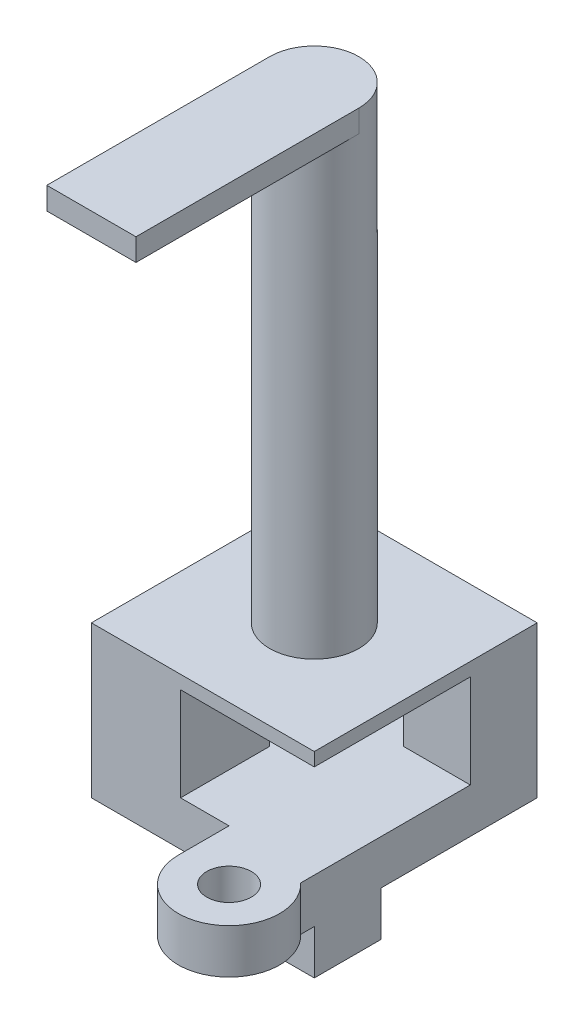
ISO-10303-21;
HEADER;
FILE_DESCRIPTION(('STEP AP214'),'2;1');
FILE_NAME('part.step','',(''),(''),'','','');
FILE_SCHEMA(('AUTOMOTIVE_DESIGN { 1 0 10303 214 1 1 1 1 }'));
ENDSEC;
DATA;
#1=APPLICATION_CONTEXT('core data for automotive mechanical design processes');
#2=APPLICATION_PROTOCOL_DEFINITION('international standard','automotive_design',2000,#1);
#3=PRODUCT_CONTEXT('',#1,'mechanical');
#4=PRODUCT('Part','Part','',(#3));
#5=PRODUCT_RELATED_PRODUCT_CATEGORY('part','',(#4));
#6=PRODUCT_DEFINITION_FORMATION('','',#4);
#7=PRODUCT_DEFINITION_CONTEXT('part definition',#1,'design');
#8=PRODUCT_DEFINITION('design','',#6,#7);
#9=PRODUCT_DEFINITION_SHAPE('','',#8);
#10=(LENGTH_UNIT() NAMED_UNIT(*) SI_UNIT(.MILLI.,.METRE.));
#11=(NAMED_UNIT(*) PLANE_ANGLE_UNIT() SI_UNIT($,.RADIAN.));
#12=(NAMED_UNIT(*) SI_UNIT($,.STERADIAN.) SOLID_ANGLE_UNIT());
#13=UNCERTAINTY_MEASURE_WITH_UNIT(LENGTH_MEASURE(1.E-05),#10,'distance_accuracy_value','');
#14=(GEOMETRIC_REPRESENTATION_CONTEXT(3) GLOBAL_UNCERTAINTY_ASSIGNED_CONTEXT((#13)) GLOBAL_UNIT_ASSIGNED_CONTEXT((#10,
#11,#12)) REPRESENTATION_CONTEXT('',''));
#15=CARTESIAN_POINT('',(0.,0.,0.));
#16=DIRECTION('',(0.,0.,1.));
#17=DIRECTION('',(1.,0.,0.));
#18=AXIS2_PLACEMENT_3D('',#15,#16,#17);
#19=CARTESIAN_POINT('',(42.2387696608268,10.,11.3627174683151));
#20=DIRECTION('',(0.,1.,0.));
#21=DIRECTION('',(0.,0.,1.));
#22=AXIS2_PLACEMENT_3D('',#19,#20,#21);
#23=PLANE('',#22);
#24=DIRECTION('',(0.723776357055051,0.,0.690034625919685));
#25=VECTOR('',#24,1.);
#26=CARTESIAN_POINT('',(3.43626604404177,10.,-40.4752499347023));
#27=LINE('',#26,#25);
#28=CARTESIAN_POINT('',(3.43626604404177,10.,-40.4752499347023));
#29=VERTEX_POINT('',#28);
#30=CARTESIAN_POINT('',(17.9342555580442,10.,-26.6531422168051));
#31=VERTEX_POINT('',#30);
#32=EDGE_CURVE('E367',#29,#31,#27,.T.);
#33=ORIENTED_EDGE('',*,*,#32,.F.);
#34=CARTESIAN_POINT('',(6.64626657364341,10.,-43.8422150146986));
#35=DIRECTION('',(0.,1.,0.));
#36=DIRECTION('',(0.,0.,1.));
#37=AXIS2_PLACEMENT_3D('',#34,#35,#36);
#38=CIRCLE('',#37,4.65194123457691);
#39=CARTESIAN_POINT('',(9.87465405870284,10.,-47.1915539787732));
#40=VERTEX_POINT('',#39);
#41=EDGE_CURVE('E365',#40,#29,#38,.T.);
#42=ORIENTED_EDGE('',*,*,#41,.F.);
#43=DIRECTION('',(-0.719987376276317,0.,-0.693987159825559));
#44=VECTOR('',#43,1.);
#45=CARTESIAN_POINT('',(9.87465405870284,10.,-47.1915539787732));
#46=LINE('',#45,#44);
#47=CARTESIAN_POINT('',(24.29674636625,10.,-33.2902729160126));
#48=VERTEX_POINT('',#47);
#49=EDGE_CURVE('E373',#48,#40,#46,.T.);
#50=ORIENTED_EDGE('',*,*,#49,.F.);
#51=CARTESIAN_POINT('',(21.1064158592592,10.,-29.9804167340048));
#52=DIRECTION('',(0.,1.,0.));
#53=DIRECTION('',(0.,0.,1.));
#54=AXIS2_PLACEMENT_3D('',#51,#52,#53);
#55=CIRCLE('',#54,4.5971030757871);
#56=EDGE_CURVE('E370',#31,#48,#55,.T.);
#57=ORIENTED_EDGE('',*,*,#56,.F.);
#58=EDGE_LOOP('',(#33,#42,#50,#57));
#59=FACE_BOUND('',#58,.T.);
#60=CARTESIAN_POINT('',(42.2387696608268,10.,11.3627174683151));
#61=DIRECTION('',(0.,1.,0.));
#62=DIRECTION('',(0.,0.,1.));
#63=AXIS2_PLACEMENT_3D('',#60,#61,#62);
#64=CIRCLE('',#63,5.);
#65=CARTESIAN_POINT('',(42.2387696608268,10.,16.3627174683151));
#66=VERTEX_POINT('',#65);
#67=EDGE_CURVE('E359',#66,#66,#64,.T.);
#68=ORIENTED_EDGE('',*,*,#67,.F.);
#69=EDGE_LOOP('',(#68));
#70=FACE_BOUND('',#69,.T.);
#71=DIRECTION('',(1.,0.,0.));
#72=VECTOR('',#71,1.);
#73=CARTESIAN_POINT('',(50.,10.,-35.));
#74=LINE('',#73,#72);
#75=CARTESIAN_POINT('',(35.,10.,-35.));
#76=VERTEX_POINT('',#75);
#77=CARTESIAN_POINT('',(50.,10.,-35.));
#78=VERTEX_POINT('',#77);
#79=EDGE_CURVE('E57',#76,#78,#74,.T.);
#80=ORIENTED_EDGE('',*,*,#79,.F.);
#81=DIRECTION('',(0.,0.,1.));
#82=VECTOR('',#81,1.);
#83=CARTESIAN_POINT('',(35.,10.,-50.));
#84=LINE('',#83,#82);
#85=CARTESIAN_POINT('',(35.,10.,-50.));
#86=VERTEX_POINT('',#85);
#87=EDGE_CURVE('E273',#86,#76,#84,.T.);
#88=ORIENTED_EDGE('',*,*,#87,.F.);
#89=DIRECTION('',(-1.,0.,0.));
#90=VECTOR('',#89,1.);
#91=CARTESIAN_POINT('',(0.,10.,-50.));
#92=LINE('',#91,#90);
#93=CARTESIAN_POINT('',(0.,10.,-50.));
#94=VERTEX_POINT('',#93);
#95=EDGE_CURVE('E407',#86,#94,#92,.T.);
#96=ORIENTED_EDGE('',*,*,#95,.T.);
#97=DIRECTION('',(0.,0.,1.));
#98=VECTOR('',#97,1.);
#99=CARTESIAN_POINT('',(0.,10.,0.));
#100=LINE('',#99,#98);
#101=CARTESIAN_POINT('',(0.,10.,-20.));
#102=VERTEX_POINT('',#101);
#103=EDGE_CURVE('E396',#94,#102,#100,.T.);
#104=ORIENTED_EDGE('',*,*,#103,.T.);
#105=DIRECTION('',(-1.,0.,0.));
#106=VECTOR('',#105,1.);
#107=CARTESIAN_POINT('',(0.,10.,-20.));
#108=LINE('',#107,#106);
#109=CARTESIAN_POINT('',(20.,10.,-20.));
#110=VERTEX_POINT('',#109);
#111=EDGE_CURVE('E296',#110,#102,#108,.T.);
#112=ORIENTED_EDGE('',*,*,#111,.F.);
#113=DIRECTION('',(0.,0.,-1.));
#114=VECTOR('',#113,1.);
#115=CARTESIAN_POINT('',(20.,10.,0.));
#116=LINE('',#115,#114);
#117=CARTESIAN_POINT('',(20.,10.,0.));
#118=VERTEX_POINT('',#117);
#119=EDGE_CURVE('E291',#118,#110,#116,.T.);
#120=ORIENTED_EDGE('',*,*,#119,.F.);
#121=DIRECTION('',(1.,0.,0.));
#122=VECTOR('',#121,1.);
#123=CARTESIAN_POINT('',(0.,10.,0.));
#124=LINE('',#123,#122);
#125=CARTESIAN_POINT('',(30.8760521925118,10.,0.));
#126=VERTEX_POINT('',#125);
#127=EDGE_CURVE('E398',#118,#126,#124,.T.);
#128=ORIENTED_EDGE('',*,*,#127,.T.);
#129=DIRECTION('',(0.,0.,1.));
#130=VECTOR('',#129,1.);
#131=CARTESIAN_POINT('',(30.8760521925118,10.,11.3627174683151));
#132=LINE('',#131,#130);
#133=CARTESIAN_POINT('',(30.8760521925118,10.,11.3627174683151));
#134=VERTEX_POINT('',#133);
#135=EDGE_CURVE('E401',#126,#134,#132,.T.);
#136=ORIENTED_EDGE('',*,*,#135,.T.);
#137=CARTESIAN_POINT('',(42.2387696608268,10.,11.3627174683151));
#138=DIRECTION('',(0.,1.,0.));
#139=DIRECTION('',(0.,0.,1.));
#140=AXIS2_PLACEMENT_3D('',#137,#138,#139);
#141=CIRCLE('',#140,11.3627174683151);
#142=CARTESIAN_POINT('',(50.,10.,3.06364210493568));
#143=VERTEX_POINT('',#142);
#144=EDGE_CURVE('E403',#134,#143,#141,.T.);
#145=ORIENTED_EDGE('',*,*,#144,.T.);
#146=DIRECTION('',(0.,0.,-1.));
#147=VECTOR('',#146,1.);
#148=CARTESIAN_POINT('',(50.,10.,0.));
#149=LINE('',#148,#147);
#150=EDGE_CURVE('E405',#143,#78,#149,.T.);
#151=ORIENTED_EDGE('',*,*,#150,.T.);
#152=EDGE_LOOP('',(#80,#88,#96,#104,#112,#120,#128,#136,#145,#151));
#153=FACE_BOUND('',#152,.T.);
#154=ADVANCED_FACE('F33',(#59,#70,#153),#23,.T.);
#155=CARTESIAN_POINT('',(42.2387696608268,0.,11.3627174683151));
#156=DIRECTION('',(0.,1.,0.));
#157=DIRECTION('',(0.,0.,1.));
#158=AXIS2_PLACEMENT_3D('',#155,#156,#157);
#159=PLANE('',#158);
#160=CARTESIAN_POINT('',(42.2387696608268,0.,11.3627174683151));
#161=DIRECTION('',(0.,1.,0.));
#162=DIRECTION('',(0.,0.,1.));
#163=AXIS2_PLACEMENT_3D('',#160,#161,#162);
#164=CIRCLE('',#163,5.);
#165=CARTESIAN_POINT('',(42.2387696608268,0.,16.3627174683151));
#166=VERTEX_POINT('',#165);
#167=EDGE_CURVE('E358',#166,#166,#164,.T.);
#168=ORIENTED_EDGE('',*,*,#167,.T.);
#169=EDGE_LOOP('',(#168));
#170=FACE_BOUND('',#169,.T.);
#171=CARTESIAN_POINT('',(6.64626657364341,0.,-43.8422150146986));
#172=DIRECTION('',(0.,1.,0.));
#173=DIRECTION('',(0.,0.,1.));
#174=AXIS2_PLACEMENT_3D('',#171,#172,#173);
#175=CIRCLE('',#174,4.65194123457691);
#176=CARTESIAN_POINT('',(9.87465405870284,0.,-47.1915539787733));
#177=VERTEX_POINT('',#176);
#178=CARTESIAN_POINT('',(3.43626604404177,0.,-40.4752499347023));
#179=VERTEX_POINT('',#178);
#180=EDGE_CURVE('E362',#177,#179,#175,.T.);
#181=ORIENTED_EDGE('',*,*,#180,.T.);
#182=DIRECTION('',(0.723776357055051,0.,0.690034625919685));
#183=VECTOR('',#182,1.);
#184=CARTESIAN_POINT('',(3.43626604404177,0.,-40.4752499347023));
#185=LINE('',#184,#183);
#186=CARTESIAN_POINT('',(17.9342555580442,0.,-26.6531422168051));
#187=VERTEX_POINT('',#186);
#188=EDGE_CURVE('E378',#179,#187,#185,.T.);
#189=ORIENTED_EDGE('',*,*,#188,.T.);
#190=CARTESIAN_POINT('',(21.1064158592592,0.,-29.9804167340048));
#191=DIRECTION('',(0.,1.,0.));
#192=DIRECTION('',(0.,0.,1.));
#193=AXIS2_PLACEMENT_3D('',#190,#191,#192);
#194=CIRCLE('',#193,4.5971030757871);
#195=CARTESIAN_POINT('',(24.29674636625,0.,-33.2902729160126));
#196=VERTEX_POINT('',#195);
#197=EDGE_CURVE('E381',#187,#196,#194,.T.);
#198=ORIENTED_EDGE('',*,*,#197,.T.);
#199=DIRECTION('',(-0.719987376276317,0.,-0.693987159825559));
#200=VECTOR('',#199,1.);
#201=CARTESIAN_POINT('',(9.87465405870284,0.,-47.1915539787732));
#202=LINE('',#201,#200);
#203=EDGE_CURVE('E368',#196,#177,#202,.T.);
#204=ORIENTED_EDGE('',*,*,#203,.T.);
#205=EDGE_LOOP('',(#181,#189,#198,#204));
#206=FACE_BOUND('',#205,.T.);
#207=DIRECTION('',(-1.,0.,0.));
#208=VECTOR('',#207,1.);
#209=CARTESIAN_POINT('',(50.,0.,0.));
#210=LINE('',#209,#208);
#211=CARTESIAN_POINT('',(50.,0.,0.));
#212=VERTEX_POINT('',#211);
#213=CARTESIAN_POINT('',(35.,0.,0.));
#214=VERTEX_POINT('',#213);
#215=EDGE_CURVE('E312',#212,#214,#210,.T.);
#216=ORIENTED_EDGE('',*,*,#215,.F.);
#217=DIRECTION('',(0.,0.,-1.));
#218=VECTOR('',#217,1.);
#219=CARTESIAN_POINT('',(50.,0.,0.));
#220=LINE('',#219,#218);
#221=CARTESIAN_POINT('',(50.,0.,3.06364210493568));
#222=VERTEX_POINT('',#221);
#223=EDGE_CURVE('E420',#222,#212,#220,.T.);
#224=ORIENTED_EDGE('',*,*,#223,.F.);
#225=CARTESIAN_POINT('',(42.2387696608268,0.,11.3627174683151));
#226=DIRECTION('',(0.,1.,0.));
#227=DIRECTION('',(0.,0.,1.));
#228=AXIS2_PLACEMENT_3D('',#225,#226,#227);
#229=CIRCLE('',#228,11.3627174683151);
#230=CARTESIAN_POINT('',(30.8760521925118,0.,11.3627174683151));
#231=VERTEX_POINT('',#230);
#232=EDGE_CURVE('E416',#231,#222,#229,.T.);
#233=ORIENTED_EDGE('',*,*,#232,.F.);
#234=DIRECTION('',(0.,0.,1.));
#235=VECTOR('',#234,1.);
#236=CARTESIAN_POINT('',(30.8760521925118,0.,11.3627174683151));
#237=LINE('',#236,#235);
#238=CARTESIAN_POINT('',(30.8760521925118,0.,0.));
#239=VERTEX_POINT('',#238);
#240=EDGE_CURVE('E414',#239,#231,#237,.T.);
#241=ORIENTED_EDGE('',*,*,#240,.F.);
#242=DIRECTION('',(1.,0.,0.));
#243=VECTOR('',#242,1.);
#244=CARTESIAN_POINT('',(0.,0.,0.));
#245=LINE('',#244,#243);
#246=CARTESIAN_POINT('',(0.,0.,0.));
#247=VERTEX_POINT('',#246);
#248=EDGE_CURVE('E412',#247,#239,#245,.T.);
#249=ORIENTED_EDGE('',*,*,#248,.F.);
#250=DIRECTION('',(0.,0.,1.));
#251=VECTOR('',#250,1.);
#252=CARTESIAN_POINT('',(0.,0.,0.));
#253=LINE('',#252,#251);
#254=CARTESIAN_POINT('',(0.,0.,-50.));
#255=VERTEX_POINT('',#254);
#256=EDGE_CURVE('E395',#255,#247,#253,.T.);
#257=ORIENTED_EDGE('',*,*,#256,.F.);
#258=DIRECTION('',(-1.,0.,0.));
#259=VECTOR('',#258,1.);
#260=CARTESIAN_POINT('',(0.,0.,-50.));
#261=LINE('',#260,#259);
#262=CARTESIAN_POINT('',(50.,0.,-50.));
#263=VERTEX_POINT('',#262);
#264=EDGE_CURVE('E399',#263,#255,#261,.T.);
#265=ORIENTED_EDGE('',*,*,#264,.F.);
#266=CARTESIAN_POINT('',(50.,0.,-15.));
#267=VERTEX_POINT('',#266);
#268=EDGE_CURVE('E419',#267,#263,#220,.T.);
#269=ORIENTED_EDGE('',*,*,#268,.F.);
#270=DIRECTION('',(1.,0.,0.));
#271=VECTOR('',#270,1.);
#272=CARTESIAN_POINT('',(50.,0.,-15.));
#273=LINE('',#272,#271);
#274=CARTESIAN_POINT('',(45.,0.,-15.));
#275=VERTEX_POINT('',#274);
#276=EDGE_CURVE('E317',#275,#267,#273,.T.);
#277=ORIENTED_EDGE('',*,*,#276,.F.);
#278=DIRECTION('',(0.,0.,-1.));
#279=VECTOR('',#278,1.);
#280=CARTESIAN_POINT('',(45.,0.,-5.));
#281=LINE('',#280,#279);
#282=CARTESIAN_POINT('',(45.,0.,-5.));
#283=VERTEX_POINT('',#282);
#284=EDGE_CURVE('E336',#283,#275,#281,.T.);
#285=ORIENTED_EDGE('',*,*,#284,.F.);
#286=DIRECTION('',(1.,0.,0.));
#287=VECTOR('',#286,1.);
#288=CARTESIAN_POINT('',(45.,0.,-5.));
#289=LINE('',#288,#287);
#290=CARTESIAN_POINT('',(35.,0.,-5.));
#291=VERTEX_POINT('',#290);
#292=EDGE_CURVE('E333',#291,#283,#289,.T.);
#293=ORIENTED_EDGE('',*,*,#292,.F.);
#294=DIRECTION('',(0.,0.,-1.));
#295=VECTOR('',#294,1.);
#296=CARTESIAN_POINT('',(35.,0.,0.));
#297=LINE('',#296,#295);
#298=EDGE_CURVE('E330',#214,#291,#297,.T.);
#299=ORIENTED_EDGE('',*,*,#298,.F.);
#300=EDGE_LOOP('',(#216,#224,#233,#241,#249,#257,#265,#269,#277,#285,#293,#299));
#301=FACE_BOUND('',#300,.T.);
#302=ADVANCED_FACE('F452',(#170,#206,#301),#159,.F.);
#303=CARTESIAN_POINT('',(0.,10.,0.));
#304=DIRECTION('',(1.,0.,0.));
#305=DIRECTION('',(0.,0.,-1.));
#306=AXIS2_PLACEMENT_3D('',#303,#304,#305);
#307=PLANE('',#306);
#308=ORIENTED_EDGE('',*,*,#256,.T.);
#309=DIRECTION('',(0.,-1.,0.));
#310=VECTOR('',#309,1.);
#311=CARTESIAN_POINT('',(0.,10.,0.));
#312=LINE('',#311,#310);
#313=CARTESIAN_POINT('',(0.,34.,0.));
#314=VERTEX_POINT('',#313);
#315=EDGE_CURVE('E37',#314,#247,#312,.T.);
#316=ORIENTED_EDGE('',*,*,#315,.F.);
#317=DIRECTION('',(0.,0.,1.));
#318=VECTOR('',#317,1.);
#319=CARTESIAN_POINT('',(0.,34.,0.));
#320=LINE('',#319,#318);
#321=CARTESIAN_POINT('',(0.,34.,-50.));
#322=VERTEX_POINT('',#321);
#323=EDGE_CURVE('E248',#322,#314,#320,.T.);
#324=ORIENTED_EDGE('',*,*,#323,.F.);
#325=DIRECTION('',(0.,-1.,0.));
#326=VECTOR('',#325,1.);
#327=CARTESIAN_POINT('',(0.,34.,-50.));
#328=LINE('',#327,#326);
#329=CARTESIAN_POINT('',(0.,31.,-50.));
#330=VERTEX_POINT('',#329);
#331=EDGE_CURVE('E259',#322,#330,#328,.T.);
#332=ORIENTED_EDGE('',*,*,#331,.T.);
#333=DIRECTION('',(0.,0.,1.));
#334=VECTOR('',#333,1.);
#335=CARTESIAN_POINT('',(0.,31.,0.));
#336=LINE('',#335,#334);
#337=CARTESIAN_POINT('',(0.,31.,-20.));
#338=VERTEX_POINT('',#337);
#339=EDGE_CURVE('E242',#330,#338,#336,.T.);
#340=ORIENTED_EDGE('',*,*,#339,.T.);
#341=DIRECTION('',(0.,-1.,0.));
#342=VECTOR('',#341,1.);
#343=CARTESIAN_POINT('',(0.,31.,-20.));
#344=LINE('',#343,#342);
#345=EDGE_CURVE('E299',#338,#102,#344,.T.);
#346=ORIENTED_EDGE('',*,*,#345,.T.);
#347=ORIENTED_EDGE('',*,*,#103,.F.);
#348=DIRECTION('',(0.,-1.,0.));
#349=VECTOR('',#348,1.);
#350=CARTESIAN_POINT('',(0.,10.,-50.));
#351=LINE('',#350,#349);
#352=EDGE_CURVE('E409',#94,#255,#351,.T.);
#353=ORIENTED_EDGE('',*,*,#352,.T.);
#354=EDGE_LOOP('',(#308,#316,#324,#332,#340,#346,#347,#353));
#355=FACE_BOUND('',#354,.T.);
#356=ADVANCED_FACE('F35',(#355),#307,.F.);
#357=CARTESIAN_POINT('',(0.,10.,0.));
#358=DIRECTION('',(0.,0.,-1.));
#359=DIRECTION('',(-1.,0.,0.));
#360=AXIS2_PLACEMENT_3D('',#357,#358,#359);
#361=PLANE('',#360);
#362=ORIENTED_EDGE('',*,*,#248,.T.);
#363=DIRECTION('',(0.,-1.,0.));
#364=VECTOR('',#363,1.);
#365=CARTESIAN_POINT('',(30.8760521925118,10.,0.));
#366=LINE('',#365,#364);
#367=EDGE_CURVE('E434',#126,#239,#366,.T.);
#368=ORIENTED_EDGE('',*,*,#367,.F.);
#369=ORIENTED_EDGE('',*,*,#127,.F.);
#370=DIRECTION('',(0.,-1.,0.));
#371=VECTOR('',#370,1.);
#372=CARTESIAN_POINT('',(20.,31.,0.));
#373=LINE('',#372,#371);
#374=CARTESIAN_POINT('',(20.,31.,0.));
#375=VERTEX_POINT('',#374);
#376=EDGE_CURVE('E309',#375,#118,#373,.T.);
#377=ORIENTED_EDGE('',*,*,#376,.F.);
#378=DIRECTION('',(1.,0.,0.));
#379=VECTOR('',#378,1.);
#380=CARTESIAN_POINT('',(0.,31.,0.));
#381=LINE('',#380,#379);
#382=CARTESIAN_POINT('',(50.,31.,0.));
#383=VERTEX_POINT('',#382);
#384=EDGE_CURVE('E262',#375,#383,#381,.T.);
#385=ORIENTED_EDGE('',*,*,#384,.T.);
#386=DIRECTION('',(0.,-1.,0.));
#387=VECTOR('',#386,1.);
#388=CARTESIAN_POINT('',(50.,34.,0.));
#389=LINE('',#388,#387);
#390=CARTESIAN_POINT('',(50.,34.,0.));
#391=VERTEX_POINT('',#390);
#392=EDGE_CURVE('E270',#391,#383,#389,.T.);
#393=ORIENTED_EDGE('',*,*,#392,.F.);
#394=DIRECTION('',(1.,0.,0.));
#395=VECTOR('',#394,1.);
#396=CARTESIAN_POINT('',(0.,34.,0.));
#397=LINE('',#396,#395);
#398=EDGE_CURVE('E251',#314,#391,#397,.T.);
#399=ORIENTED_EDGE('',*,*,#398,.F.);
#400=ORIENTED_EDGE('',*,*,#315,.T.);
#401=EDGE_LOOP('',(#362,#368,#369,#377,#385,#393,#399,#400));
#402=FACE_BOUND('',#401,.T.);
#403=ADVANCED_FACE('F443',(#402),#361,.F.);
#404=CARTESIAN_POINT('',(30.8760521925118,10.,11.3627174683151));
#405=DIRECTION('',(1.,0.,0.));
#406=DIRECTION('',(0.,0.,-1.));
#407=AXIS2_PLACEMENT_3D('',#404,#405,#406);
#408=PLANE('',#407);
#409=ORIENTED_EDGE('',*,*,#240,.T.);
#410=DIRECTION('',(0.,-1.,0.));
#411=VECTOR('',#410,1.);
#412=CARTESIAN_POINT('',(30.8760521925118,10.,11.3627174683151));
#413=LINE('',#412,#411);
#414=EDGE_CURVE('E432',#134,#231,#413,.T.);
#415=ORIENTED_EDGE('',*,*,#414,.F.);
#416=ORIENTED_EDGE('',*,*,#135,.F.);
#417=ORIENTED_EDGE('',*,*,#367,.T.);
#418=EDGE_LOOP('',(#409,#415,#416,#417));
#419=FACE_BOUND('',#418,.T.);
#420=ADVANCED_FACE('F455',(#419),#408,.F.);
#421=CARTESIAN_POINT('',(42.2387696608268,10.,11.3627174683151));
#422=DIRECTION('',(0.,-1.,0.));
#423=DIRECTION('',(0.,0.,-1.));
#424=AXIS2_PLACEMENT_3D('',#421,#422,#423);
#425=CYLINDRICAL_SURFACE('',#424,11.3627174683151);
#426=ORIENTED_EDGE('',*,*,#232,.T.);
#427=DIRECTION('',(0.,-1.,0.));
#428=VECTOR('',#427,1.);
#429=CARTESIAN_POINT('',(50.,10.,3.06364210493568));
#430=LINE('',#429,#428);
#431=EDGE_CURVE('E429',#143,#222,#430,.T.);
#432=ORIENTED_EDGE('',*,*,#431,.F.);
#433=ORIENTED_EDGE('',*,*,#144,.F.);
#434=ORIENTED_EDGE('',*,*,#414,.T.);
#435=EDGE_LOOP('',(#426,#432,#433,#434));
#436=FACE_BOUND('',#435,.T.);
#437=ADVANCED_FACE('F458',(#436),#425,.T.);
#438=CARTESIAN_POINT('',(50.,10.,0.));
#439=DIRECTION('',(-1.,0.,0.));
#440=DIRECTION('',(0.,0.,1.));
#441=AXIS2_PLACEMENT_3D('',#438,#439,#440);
#442=PLANE('',#441);
#443=ORIENTED_EDGE('',*,*,#223,.T.);
#444=DIRECTION('',(0.,1.,0.));
#445=VECTOR('',#444,1.);
#446=CARTESIAN_POINT('',(50.,-10.,0.));
#447=LINE('',#446,#445);
#448=CARTESIAN_POINT('',(50.,-10.,0.));
#449=VERTEX_POINT('',#448);
#450=EDGE_CURVE('E327',#449,#212,#447,.T.);
#451=ORIENTED_EDGE('',*,*,#450,.F.);
#452=DIRECTION('',(0.,0.,1.));
#453=VECTOR('',#452,1.);
#454=CARTESIAN_POINT('',(50.,-10.,-15.));
#455=LINE('',#454,#453);
#456=CARTESIAN_POINT('',(50.,-10.,-15.));
#457=VERTEX_POINT('',#456);
#458=EDGE_CURVE('E325',#457,#449,#455,.T.);
#459=ORIENTED_EDGE('',*,*,#458,.F.);
#460=DIRECTION('',(0.,1.,0.));
#461=VECTOR('',#460,1.);
#462=CARTESIAN_POINT('',(50.,-10.,-15.));
#463=LINE('',#462,#461);
#464=EDGE_CURVE('E343',#457,#267,#463,.T.);
#465=ORIENTED_EDGE('',*,*,#464,.T.);
#466=ORIENTED_EDGE('',*,*,#268,.T.);
#467=DIRECTION('',(0.,-1.,0.));
#468=VECTOR('',#467,1.);
#469=CARTESIAN_POINT('',(50.,10.,-50.));
#470=LINE('',#469,#468);
#471=CARTESIAN_POINT('',(50.,34.,-50.));
#472=VERTEX_POINT('',#471);
#473=EDGE_CURVE('E426',#472,#263,#470,.T.);
#474=ORIENTED_EDGE('',*,*,#473,.F.);
#475=DIRECTION('',(0.,0.,-1.));
#476=VECTOR('',#475,1.);
#477=CARTESIAN_POINT('',(50.,34.,0.));
#478=LINE('',#477,#476);
#479=EDGE_CURVE('E254',#391,#472,#478,.T.);
#480=ORIENTED_EDGE('',*,*,#479,.F.);
#481=ORIENTED_EDGE('',*,*,#392,.T.);
#482=DIRECTION('',(0.,0.,-1.));
#483=VECTOR('',#482,1.);
#484=CARTESIAN_POINT('',(50.,31.,0.));
#485=LINE('',#484,#483);
#486=CARTESIAN_POINT('',(50.,31.,-35.));
#487=VERTEX_POINT('',#486);
#488=EDGE_CURVE('E264',#383,#487,#485,.T.);
#489=ORIENTED_EDGE('',*,*,#488,.T.);
#490=DIRECTION('',(0.,-1.,0.));
#491=VECTOR('',#490,1.);
#492=CARTESIAN_POINT('',(50.,31.,-35.));
#493=LINE('',#492,#491);
#494=EDGE_CURVE('E280',#487,#78,#493,.T.);
#495=ORIENTED_EDGE('',*,*,#494,.T.);
#496=ORIENTED_EDGE('',*,*,#150,.F.);
#497=ORIENTED_EDGE('',*,*,#431,.T.);
#498=EDGE_LOOP('',(#443,#451,#459,#465,#466,#474,#480,#481,#489,#495,#496,#497));
#499=FACE_BOUND('',#498,.T.);
#500=ADVANCED_FACE('F472',(#499),#442,.F.);
#501=CARTESIAN_POINT('',(0.,10.,-50.));
#502=DIRECTION('',(0.,0.,1.));
#503=DIRECTION('',(1.,0.,0.));
#504=AXIS2_PLACEMENT_3D('',#501,#502,#503);
#505=PLANE('',#504);
#506=ORIENTED_EDGE('',*,*,#264,.T.);
#507=ORIENTED_EDGE('',*,*,#352,.F.);
#508=ORIENTED_EDGE('',*,*,#95,.F.);
#509=DIRECTION('',(0.,-1.,0.));
#510=VECTOR('',#509,1.);
#511=CARTESIAN_POINT('',(35.,31.,-50.));
#512=LINE('',#511,#510);
#513=CARTESIAN_POINT('',(35.,31.,-50.));
#514=VERTEX_POINT('',#513);
#515=EDGE_CURVE('E288',#514,#86,#512,.T.);
#516=ORIENTED_EDGE('',*,*,#515,.F.);
#517=DIRECTION('',(-1.,0.,0.));
#518=VECTOR('',#517,1.);
#519=CARTESIAN_POINT('',(0.,31.,-50.));
#520=LINE('',#519,#518);
#521=EDGE_CURVE('E252',#514,#330,#520,.T.);
#522=ORIENTED_EDGE('',*,*,#521,.T.);
#523=ORIENTED_EDGE('',*,*,#331,.F.);
#524=DIRECTION('',(-1.,0.,0.));
#525=VECTOR('',#524,1.);
#526=CARTESIAN_POINT('',(0.,34.,-50.));
#527=LINE('',#526,#525);
#528=EDGE_CURVE('E257',#472,#322,#527,.T.);
#529=ORIENTED_EDGE('',*,*,#528,.F.);
#530=ORIENTED_EDGE('',*,*,#473,.T.);
#531=EDGE_LOOP('',(#506,#507,#508,#516,#522,#523,#529,#530));
#532=FACE_BOUND('',#531,.T.);
#533=ADVANCED_FACE('F478',(#532),#505,.F.);
#534=CARTESIAN_POINT('',(6.64626657364341,10.,-43.8422150146986));
#535=DIRECTION('',(0.,-1.,0.));
#536=DIRECTION('',(0.,0.,-1.));
#537=AXIS2_PLACEMENT_3D('',#534,#535,#536);
#538=CYLINDRICAL_SURFACE('',#537,4.65194123457691);
#539=ORIENTED_EDGE('',*,*,#180,.F.);
#540=DIRECTION('',(0.,-1.,0.));
#541=VECTOR('',#540,1.);
#542=CARTESIAN_POINT('',(9.87465405870284,10.,-47.1915539787732));
#543=LINE('',#542,#541);
#544=EDGE_CURVE('E375',#40,#177,#543,.T.);
#545=ORIENTED_EDGE('',*,*,#544,.F.);
#546=ORIENTED_EDGE('',*,*,#41,.T.);
#547=DIRECTION('',(0.,-1.,0.));
#548=VECTOR('',#547,1.);
#549=CARTESIAN_POINT('',(3.43626604404177,10.,-40.4752499347023));
#550=LINE('',#549,#548);
#551=EDGE_CURVE('E392',#29,#179,#550,.T.);
#552=ORIENTED_EDGE('',*,*,#551,.T.);
#553=EDGE_LOOP('',(#539,#545,#546,#552));
#554=FACE_BOUND('',#553,.T.);
#555=ADVANCED_FACE('F532',(#554),#538,.F.);
#556=CARTESIAN_POINT('',(3.43626604404177,10.,-40.4752499347023));
#557=DIRECTION('',(0.690034625919685,0.,-0.723776357055051));
#558=DIRECTION('',(-0.723776357055051,0.,-0.690034625919685));
#559=AXIS2_PLACEMENT_3D('',#556,#557,#558);
#560=PLANE('',#559);
#561=ORIENTED_EDGE('',*,*,#188,.F.);
#562=ORIENTED_EDGE('',*,*,#551,.F.);
#563=ORIENTED_EDGE('',*,*,#32,.T.);
#564=DIRECTION('',(0.,-1.,0.));
#565=VECTOR('',#564,1.);
#566=CARTESIAN_POINT('',(17.9342555580442,10.,-26.6531422168051));
#567=LINE('',#566,#565);
#568=EDGE_CURVE('E390',#31,#187,#567,.T.);
#569=ORIENTED_EDGE('',*,*,#568,.T.);
#570=EDGE_LOOP('',(#561,#562,#563,#569));
#571=FACE_BOUND('',#570,.T.);
#572=ADVANCED_FACE('F791',(#571),#560,.T.);
#573=CARTESIAN_POINT('',(21.1064158592592,10.,-29.9804167340048));
#574=DIRECTION('',(0.,-1.,0.));
#575=DIRECTION('',(0.,0.,-1.));
#576=AXIS2_PLACEMENT_3D('',#573,#574,#575);
#577=CYLINDRICAL_SURFACE('',#576,4.5971030757871);
#578=ORIENTED_EDGE('',*,*,#197,.F.);
#579=ORIENTED_EDGE('',*,*,#568,.F.);
#580=ORIENTED_EDGE('',*,*,#56,.T.);
#581=DIRECTION('',(0.,-1.,0.));
#582=VECTOR('',#581,1.);
#583=CARTESIAN_POINT('',(24.29674636625,10.,-33.2902729160126));
#584=LINE('',#583,#582);
#585=EDGE_CURVE('E388',#48,#196,#584,.T.);
#586=ORIENTED_EDGE('',*,*,#585,.T.);
#587=EDGE_LOOP('',(#578,#579,#580,#586));
#588=FACE_BOUND('',#587,.T.);
#589=ADVANCED_FACE('F800',(#588),#577,.F.);
#590=CARTESIAN_POINT('',(9.87465405870284,10.,-47.1915539787732));
#591=DIRECTION('',(-0.693987159825559,0.,0.719987376276317));
#592=DIRECTION('',(0.719987376276317,0.,0.693987159825559));
#593=AXIS2_PLACEMENT_3D('',#590,#591,#592);
#594=PLANE('',#593);
#595=ORIENTED_EDGE('',*,*,#203,.F.);
#596=ORIENTED_EDGE('',*,*,#585,.F.);
#597=ORIENTED_EDGE('',*,*,#49,.T.);
#598=ORIENTED_EDGE('',*,*,#544,.T.);
#599=EDGE_LOOP('',(#595,#596,#597,#598));
#600=FACE_BOUND('',#599,.T.);
#601=ADVANCED_FACE('F808',(#600),#594,.T.);
#602=CARTESIAN_POINT('',(42.2387696608268,10.,11.3627174683151));
#603=DIRECTION('',(0.,-1.,0.));
#604=DIRECTION('',(0.,0.,-1.));
#605=AXIS2_PLACEMENT_3D('',#602,#603,#604);
#606=CYLINDRICAL_SURFACE('',#605,5.);
#607=ORIENTED_EDGE('',*,*,#67,.T.);
#608=EDGE_LOOP('',(#607));
#609=FACE_BOUND('',#608,.T.);
#610=ORIENTED_EDGE('',*,*,#167,.F.);
#611=EDGE_LOOP('',(#610));
#612=FACE_BOUND('',#611,.T.);
#613=ADVANCED_FACE('F519',(#609,#612),#606,.F.);
#614=CARTESIAN_POINT('',(50.,-10.,0.));
#615=DIRECTION('',(0.,0.,-1.));
#616=DIRECTION('',(-1.,0.,0.));
#617=AXIS2_PLACEMENT_3D('',#614,#615,#616);
#618=PLANE('',#617);
#619=ORIENTED_EDGE('',*,*,#215,.T.);
#620=DIRECTION('',(0.,1.,0.));
#621=VECTOR('',#620,1.);
#622=CARTESIAN_POINT('',(35.,-10.,0.));
#623=LINE('',#622,#621);
#624=CARTESIAN_POINT('',(35.,-10.,0.));
#625=VERTEX_POINT('',#624);
#626=EDGE_CURVE('E355',#625,#214,#623,.T.);
#627=ORIENTED_EDGE('',*,*,#626,.F.);
#628=DIRECTION('',(-1.,0.,0.));
#629=VECTOR('',#628,1.);
#630=CARTESIAN_POINT('',(50.,-10.,0.));
#631=LINE('',#630,#629);
#632=EDGE_CURVE('E313',#449,#625,#631,.T.);
#633=ORIENTED_EDGE('',*,*,#632,.F.);
#634=ORIENTED_EDGE('',*,*,#450,.T.);
#635=EDGE_LOOP('',(#619,#627,#633,#634));
#636=FACE_BOUND('',#635,.T.);
#637=ADVANCED_FACE('F493',(#636),#618,.F.);
#638=CARTESIAN_POINT('',(35.,-10.,0.));
#639=DIRECTION('',(1.,0.,0.));
#640=DIRECTION('',(0.,0.,-1.));
#641=AXIS2_PLACEMENT_3D('',#638,#639,#640);
#642=PLANE('',#641);
#643=ORIENTED_EDGE('',*,*,#298,.T.);
#644=DIRECTION('',(0.,1.,0.));
#645=VECTOR('',#644,1.);
#646=CARTESIAN_POINT('',(35.,-10.,-5.));
#647=LINE('',#646,#645);
#648=CARTESIAN_POINT('',(35.,-10.,-5.));
#649=VERTEX_POINT('',#648);
#650=EDGE_CURVE('E352',#649,#291,#647,.T.);
#651=ORIENTED_EDGE('',*,*,#650,.F.);
#652=DIRECTION('',(0.,0.,-1.));
#653=VECTOR('',#652,1.);
#654=CARTESIAN_POINT('',(35.,-10.,0.));
#655=LINE('',#654,#653);
#656=EDGE_CURVE('E316',#625,#649,#655,.T.);
#657=ORIENTED_EDGE('',*,*,#656,.F.);
#658=ORIENTED_EDGE('',*,*,#626,.T.);
#659=EDGE_LOOP('',(#643,#651,#657,#658));
#660=FACE_BOUND('',#659,.T.);
#661=ADVANCED_FACE('F511',(#660),#642,.F.);
#662=CARTESIAN_POINT('',(45.,-10.,-5.));
#663=DIRECTION('',(0.,0.,1.));
#664=DIRECTION('',(1.,0.,0.));
#665=AXIS2_PLACEMENT_3D('',#662,#663,#664);
#666=PLANE('',#665);
#667=ORIENTED_EDGE('',*,*,#292,.T.);
#668=DIRECTION('',(0.,1.,0.));
#669=VECTOR('',#668,1.);
#670=CARTESIAN_POINT('',(45.,-10.,-5.));
#671=LINE('',#670,#669);
#672=CARTESIAN_POINT('',(45.,-10.,-5.));
#673=VERTEX_POINT('',#672);
#674=EDGE_CURVE('E349',#673,#283,#671,.T.);
#675=ORIENTED_EDGE('',*,*,#674,.F.);
#676=DIRECTION('',(1.,0.,0.));
#677=VECTOR('',#676,1.);
#678=CARTESIAN_POINT('',(45.,-10.,-5.));
#679=LINE('',#678,#677);
#680=EDGE_CURVE('E319',#649,#673,#679,.T.);
#681=ORIENTED_EDGE('',*,*,#680,.F.);
#682=ORIENTED_EDGE('',*,*,#650,.T.);
#683=EDGE_LOOP('',(#667,#675,#681,#682));
#684=FACE_BOUND('',#683,.T.);
#685=ADVANCED_FACE('F509',(#684),#666,.F.);
#686=CARTESIAN_POINT('',(45.,-10.,-5.));
#687=DIRECTION('',(1.,0.,0.));
#688=DIRECTION('',(0.,0.,-1.));
#689=AXIS2_PLACEMENT_3D('',#686,#687,#688);
#690=PLANE('',#689);
#691=ORIENTED_EDGE('',*,*,#284,.T.);
#692=DIRECTION('',(0.,1.,0.));
#693=VECTOR('',#692,1.);
#694=CARTESIAN_POINT('',(45.,-10.,-15.));
#695=LINE('',#694,#693);
#696=CARTESIAN_POINT('',(45.,-10.,-15.));
#697=VERTEX_POINT('',#696);
#698=EDGE_CURVE('E346',#697,#275,#695,.T.);
#699=ORIENTED_EDGE('',*,*,#698,.F.);
#700=DIRECTION('',(0.,0.,-1.));
#701=VECTOR('',#700,1.);
#702=CARTESIAN_POINT('',(45.,-10.,-5.));
#703=LINE('',#702,#701);
#704=EDGE_CURVE('E321',#673,#697,#703,.T.);
#705=ORIENTED_EDGE('',*,*,#704,.F.);
#706=ORIENTED_EDGE('',*,*,#674,.T.);
#707=EDGE_LOOP('',(#691,#699,#705,#706));
#708=FACE_BOUND('',#707,.T.);
#709=ADVANCED_FACE('F504',(#708),#690,.F.);
#710=CARTESIAN_POINT('',(50.,-10.,-15.));
#711=DIRECTION('',(0.,0.,1.));
#712=DIRECTION('',(1.,0.,0.));
#713=AXIS2_PLACEMENT_3D('',#710,#711,#712);
#714=PLANE('',#713);
#715=ORIENTED_EDGE('',*,*,#276,.T.);
#716=ORIENTED_EDGE('',*,*,#464,.F.);
#717=DIRECTION('',(1.,0.,0.));
#718=VECTOR('',#717,1.);
#719=CARTESIAN_POINT('',(50.,-10.,-15.));
#720=LINE('',#719,#718);
#721=EDGE_CURVE('E323',#697,#457,#720,.T.);
#722=ORIENTED_EDGE('',*,*,#721,.F.);
#723=ORIENTED_EDGE('',*,*,#698,.T.);
#724=EDGE_LOOP('',(#715,#716,#722,#723));
#725=FACE_BOUND('',#724,.T.);
#726=ADVANCED_FACE('F501',(#725),#714,.F.);
#727=CARTESIAN_POINT('',(0.,-10.,0.));
#728=DIRECTION('',(0.,-1.,0.));
#729=DIRECTION('',(0.,0.,-1.));
#730=AXIS2_PLACEMENT_3D('',#727,#728,#729);
#731=PLANE('',#730);
#732=ORIENTED_EDGE('',*,*,#632,.T.);
#733=ORIENTED_EDGE('',*,*,#656,.T.);
#734=ORIENTED_EDGE('',*,*,#680,.T.);
#735=ORIENTED_EDGE('',*,*,#704,.T.);
#736=ORIENTED_EDGE('',*,*,#721,.T.);
#737=ORIENTED_EDGE('',*,*,#458,.T.);
#738=EDGE_LOOP('',(#732,#733,#734,#735,#736,#737));
#739=FACE_BOUND('',#738,.T.);
#740=ADVANCED_FACE('F496',(#739),#731,.T.);
#741=CARTESIAN_POINT('',(20.,31.,0.));
#742=DIRECTION('',(-1.,0.,0.));
#743=DIRECTION('',(0.,0.,1.));
#744=AXIS2_PLACEMENT_3D('',#741,#742,#743);
#745=PLANE('',#744);
#746=ORIENTED_EDGE('',*,*,#119,.T.);
#747=DIRECTION('',(0.,-1.,0.));
#748=VECTOR('',#747,1.);
#749=CARTESIAN_POINT('',(20.,31.,-20.));
#750=LINE('',#749,#748);
#751=CARTESIAN_POINT('',(20.,31.,-20.));
#752=VERTEX_POINT('',#751);
#753=EDGE_CURVE('E306',#752,#110,#750,.T.);
#754=ORIENTED_EDGE('',*,*,#753,.F.);
#755=DIRECTION('',(0.,0.,-1.));
#756=VECTOR('',#755,1.);
#757=CARTESIAN_POINT('',(20.,31.,0.));
#758=LINE('',#757,#756);
#759=EDGE_CURVE('E292',#375,#752,#758,.T.);
#760=ORIENTED_EDGE('',*,*,#759,.F.);
#761=ORIENTED_EDGE('',*,*,#376,.T.);
#762=EDGE_LOOP('',(#746,#754,#760,#761));
#763=FACE_BOUND('',#762,.T.);
#764=ADVANCED_FACE('F464',(#763),#745,.F.);
#765=CARTESIAN_POINT('',(0.,31.,-20.));
#766=DIRECTION('',(0.,0.,1.));
#767=DIRECTION('',(1.,0.,0.));
#768=AXIS2_PLACEMENT_3D('',#765,#766,#767);
#769=PLANE('',#768);
#770=ORIENTED_EDGE('',*,*,#111,.T.);
#771=ORIENTED_EDGE('',*,*,#345,.F.);
#772=DIRECTION('',(-1.,0.,0.));
#773=VECTOR('',#772,1.);
#774=CARTESIAN_POINT('',(0.,31.,-20.));
#775=LINE('',#774,#773);
#776=EDGE_CURVE('E295',#752,#338,#775,.T.);
#777=ORIENTED_EDGE('',*,*,#776,.F.);
#778=ORIENTED_EDGE('',*,*,#753,.T.);
#779=EDGE_LOOP('',(#770,#771,#777,#778));
#780=FACE_BOUND('',#779,.T.);
#781=ADVANCED_FACE('F482',(#780),#769,.F.);
#782=CARTESIAN_POINT('',(35.,31.,-50.));
#783=DIRECTION('',(1.,0.,0.));
#784=DIRECTION('',(0.,0.,-1.));
#785=AXIS2_PLACEMENT_3D('',#782,#783,#784);
#786=PLANE('',#785);
#787=ORIENTED_EDGE('',*,*,#87,.T.);
#788=DIRECTION('',(0.,-1.,0.));
#789=VECTOR('',#788,1.);
#790=CARTESIAN_POINT('',(35.,31.,-35.));
#791=LINE('',#790,#789);
#792=CARTESIAN_POINT('',(35.,31.,-35.));
#793=VERTEX_POINT('',#792);
#794=EDGE_CURVE('E285',#793,#76,#791,.T.);
#795=ORIENTED_EDGE('',*,*,#794,.F.);
#796=DIRECTION('',(0.,0.,1.));
#797=VECTOR('',#796,1.);
#798=CARTESIAN_POINT('',(35.,31.,-50.));
#799=LINE('',#798,#797);
#800=EDGE_CURVE('E274',#514,#793,#799,.T.);
#801=ORIENTED_EDGE('',*,*,#800,.F.);
#802=ORIENTED_EDGE('',*,*,#515,.T.);
#803=EDGE_LOOP('',(#787,#795,#801,#802));
#804=FACE_BOUND('',#803,.T.);
#805=ADVANCED_FACE('F485',(#804),#786,.F.);
#806=CARTESIAN_POINT('',(50.,31.,-35.));
#807=DIRECTION('',(0.,0.,-1.));
#808=DIRECTION('',(-1.,0.,0.));
#809=AXIS2_PLACEMENT_3D('',#806,#807,#808);
#810=PLANE('',#809);
#811=ORIENTED_EDGE('',*,*,#79,.T.);
#812=ORIENTED_EDGE('',*,*,#494,.F.);
#813=DIRECTION('',(1.,0.,0.));
#814=VECTOR('',#813,1.);
#815=CARTESIAN_POINT('',(50.,31.,-35.));
#816=LINE('',#815,#814);
#817=EDGE_CURVE('E277',#793,#487,#816,.T.);
#818=ORIENTED_EDGE('',*,*,#817,.F.);
#819=ORIENTED_EDGE('',*,*,#794,.T.);
#820=EDGE_LOOP('',(#811,#812,#818,#819));
#821=FACE_BOUND('',#820,.T.);
#822=ADVANCED_FACE('F488',(#821),#810,.F.);
#823=CARTESIAN_POINT('',(0.,34.,0.));
#824=DIRECTION('',(0.,-1.,0.));
#825=DIRECTION('',(0.,0.,-1.));
#826=AXIS2_PLACEMENT_3D('',#823,#824,#825);
#827=PLANE('',#826);
#828=CARTESIAN_POINT('',(25.,34.,-25.));
#829=DIRECTION('',(0.,1.,0.));
#830=DIRECTION('',(0.,0.,1.));
#831=AXIS2_PLACEMENT_3D('',#828,#829,#830);
#832=CIRCLE('',#831,10.);
#833=CARTESIAN_POINT('',(25.,34.,-15.));
#834=VERTEX_POINT('',#833);
#835=EDGE_CURVE('E11',#834,#834,#832,.T.);
#836=ORIENTED_EDGE('',*,*,#835,.F.);
#837=EDGE_LOOP('',(#836));
#838=FACE_BOUND('',#837,.T.);
#839=ORIENTED_EDGE('',*,*,#323,.T.);
#840=ORIENTED_EDGE('',*,*,#398,.T.);
#841=ORIENTED_EDGE('',*,*,#479,.T.);
#842=ORIENTED_EDGE('',*,*,#528,.T.);
#843=EDGE_LOOP('',(#839,#840,#841,#842));
#844=FACE_BOUND('',#843,.T.);
#845=ADVANCED_FACE('F475',(#838,#844),#827,.F.);
#846=CARTESIAN_POINT('',(0.,31.,0.));
#847=DIRECTION('',(0.,-1.,0.));
#848=DIRECTION('',(0.,0.,-1.));
#849=AXIS2_PLACEMENT_3D('',#846,#847,#848);
#850=PLANE('',#849);
#851=ORIENTED_EDGE('',*,*,#384,.F.);
#852=ORIENTED_EDGE('',*,*,#759,.T.);
#853=ORIENTED_EDGE('',*,*,#776,.T.);
#854=ORIENTED_EDGE('',*,*,#339,.F.);
#855=ORIENTED_EDGE('',*,*,#521,.F.);
#856=ORIENTED_EDGE('',*,*,#800,.T.);
#857=ORIENTED_EDGE('',*,*,#817,.T.);
#858=ORIENTED_EDGE('',*,*,#488,.F.);
#859=EDGE_LOOP('',(#851,#852,#853,#854,#855,#856,#857,#858));
#860=FACE_BOUND('',#859,.T.);
#861=ADVANCED_FACE('F469',(#860),#850,.T.);
#862=CARTESIAN_POINT('',(25.,134.,-25.));
#863=DIRECTION('',(0.,-1.,0.));
#864=DIRECTION('',(0.,0.,-1.));
#865=AXIS2_PLACEMENT_3D('',#862,#863,#864);
#866=CYLINDRICAL_SURFACE('',#865,10.);
#867=CARTESIAN_POINT('',(25.,134.,-25.));
#868=DIRECTION('',(0.,1.,0.));
#869=DIRECTION('',(0.,0.,1.));
#870=AXIS2_PLACEMENT_3D('',#867,#868,#869);
#871=CIRCLE('',#870,10.);
#872=CARTESIAN_POINT('',(15.,134.,-25.));
#873=VERTEX_POINT('',#872);
#874=CARTESIAN_POINT('',(35.,134.,-25.));
#875=VERTEX_POINT('',#874);
#876=EDGE_CURVE('E49',#873,#875,#871,.T.);
#877=ORIENTED_EDGE('',*,*,#876,.F.);
#878=DIRECTION('',(0.,-1.,0.));
#879=VECTOR('',#878,1.);
#880=CARTESIAN_POINT('',(15.,139.,-25.));
#881=LINE('',#880,#879);
#882=CARTESIAN_POINT('',(15.,139.,-25.));
#883=VERTEX_POINT('',#882);
#884=EDGE_CURVE('E224',#883,#873,#881,.T.);
#885=ORIENTED_EDGE('',*,*,#884,.F.);
#886=CARTESIAN_POINT('',(25.,139.,-25.));
#887=DIRECTION('',(0.,1.,0.));
#888=DIRECTION('',(0.,0.,1.));
#889=AXIS2_PLACEMENT_3D('',#886,#887,#888);
#890=CIRCLE('',#889,10.);
#891=CARTESIAN_POINT('',(35.,139.,-25.));
#892=VERTEX_POINT('',#891);
#893=EDGE_CURVE('E230',#892,#883,#890,.T.);
#894=ORIENTED_EDGE('',*,*,#893,.F.);
#895=DIRECTION('',(0.,-1.,0.));
#896=VECTOR('',#895,1.);
#897=CARTESIAN_POINT('',(35.,139.,-25.));
#898=LINE('',#897,#896);
#899=EDGE_CURVE('E749',#892,#875,#898,.T.);
#900=ORIENTED_EDGE('',*,*,#899,.T.);
#901=EDGE_LOOP('',(#877,#885,#894,#900));
#902=FACE_BOUND('',#901,.T.);
#903=ORIENTED_EDGE('',*,*,#835,.T.);
#904=EDGE_LOOP('',(#903));
#905=FACE_BOUND('',#904,.T.);
#906=ADVANCED_FACE('F239',(#902,#905),#866,.T.);
#907=CARTESIAN_POINT('',(25.,134.,-25.));
#908=DIRECTION('',(0.,1.,0.));
#909=DIRECTION('',(0.,0.,1.));
#910=AXIS2_PLACEMENT_3D('',#907,#908,#909);
#911=PLANE('',#910);
#912=DIRECTION('',(0.,0.,1.));
#913=VECTOR('',#912,1.);
#914=CARTESIAN_POINT('',(15.,134.,-25.));
#915=LINE('',#914,#913);
#916=CARTESIAN_POINT('',(15.,134.,25.));
#917=VERTEX_POINT('',#916);
#918=EDGE_CURVE('E758',#873,#917,#915,.T.);
#919=ORIENTED_EDGE('',*,*,#918,.F.);
#920=ORIENTED_EDGE('',*,*,#876,.T.);
#921=DIRECTION('',(0.,0.,-1.));
#922=VECTOR('',#921,1.);
#923=CARTESIAN_POINT('',(35.,134.,-25.));
#924=LINE('',#923,#922);
#925=CARTESIAN_POINT('',(35.,134.,25.));
#926=VERTEX_POINT('',#925);
#927=EDGE_CURVE('E237',#926,#875,#924,.T.);
#928=ORIENTED_EDGE('',*,*,#927,.F.);
#929=DIRECTION('',(1.,0.,0.));
#930=VECTOR('',#929,1.);
#931=CARTESIAN_POINT('',(35.,134.,25.));
#932=LINE('',#931,#930);
#933=EDGE_CURVE('E752',#917,#926,#932,.T.);
#934=ORIENTED_EDGE('',*,*,#933,.F.);
#935=EDGE_LOOP('',(#919,#920,#928,#934));
#936=FACE_BOUND('',#935,.T.);
#937=ADVANCED_FACE('F697',(#936),#911,.F.);
#938=CARTESIAN_POINT('',(15.,139.,-25.));
#939=DIRECTION('',(1.,0.,0.));
#940=DIRECTION('',(0.,0.,-1.));
#941=AXIS2_PLACEMENT_3D('',#938,#939,#940);
#942=PLANE('',#941);
#943=ORIENTED_EDGE('',*,*,#918,.T.);
#944=DIRECTION('',(0.,-1.,0.));
#945=VECTOR('',#944,1.);
#946=CARTESIAN_POINT('',(15.,139.,25.));
#947=LINE('',#946,#945);
#948=CARTESIAN_POINT('',(15.,139.,25.));
#949=VERTEX_POINT('',#948);
#950=EDGE_CURVE('E226',#949,#917,#947,.T.);
#951=ORIENTED_EDGE('',*,*,#950,.F.);
#952=DIRECTION('',(0.,0.,1.));
#953=VECTOR('',#952,1.);
#954=CARTESIAN_POINT('',(15.,139.,-25.));
#955=LINE('',#954,#953);
#956=EDGE_CURVE('E221',#883,#949,#955,.T.);
#957=ORIENTED_EDGE('',*,*,#956,.F.);
#958=ORIENTED_EDGE('',*,*,#884,.T.);
#959=EDGE_LOOP('',(#943,#951,#957,#958));
#960=FACE_BOUND('',#959,.T.);
#961=ADVANCED_FACE('F223',(#960),#942,.F.);
#962=CARTESIAN_POINT('',(35.,139.,25.));
#963=DIRECTION('',(0.,0.,-1.));
#964=DIRECTION('',(-1.,0.,0.));
#965=AXIS2_PLACEMENT_3D('',#962,#963,#964);
#966=PLANE('',#965);
#967=ORIENTED_EDGE('',*,*,#933,.T.);
#968=DIRECTION('',(0.,-1.,0.));
#969=VECTOR('',#968,1.);
#970=CARTESIAN_POINT('',(35.,139.,25.));
#971=LINE('',#970,#969);
#972=CARTESIAN_POINT('',(35.,139.,25.));
#973=VERTEX_POINT('',#972);
#974=EDGE_CURVE('E244',#973,#926,#971,.T.);
#975=ORIENTED_EDGE('',*,*,#974,.F.);
#976=DIRECTION('',(1.,0.,0.));
#977=VECTOR('',#976,1.);
#978=CARTESIAN_POINT('',(35.,139.,25.));
#979=LINE('',#978,#977);
#980=EDGE_CURVE('E229',#949,#973,#979,.T.);
#981=ORIENTED_EDGE('',*,*,#980,.F.);
#982=ORIENTED_EDGE('',*,*,#950,.T.);
#983=EDGE_LOOP('',(#967,#975,#981,#982));
#984=FACE_BOUND('',#983,.T.);
#985=ADVANCED_FACE('F715',(#984),#966,.F.);
#986=CARTESIAN_POINT('',(35.,139.,-25.));
#987=DIRECTION('',(-1.,0.,0.));
#988=DIRECTION('',(0.,0.,1.));
#989=AXIS2_PLACEMENT_3D('',#986,#987,#988);
#990=PLANE('',#989);
#991=ORIENTED_EDGE('',*,*,#927,.T.);
#992=ORIENTED_EDGE('',*,*,#899,.F.);
#993=DIRECTION('',(0.,0.,-1.));
#994=VECTOR('',#993,1.);
#995=CARTESIAN_POINT('',(35.,139.,-25.));
#996=LINE('',#995,#994);
#997=EDGE_CURVE('E235',#973,#892,#996,.T.);
#998=ORIENTED_EDGE('',*,*,#997,.F.);
#999=ORIENTED_EDGE('',*,*,#974,.T.);
#1000=EDGE_LOOP('',(#991,#992,#998,#999));
#1001=FACE_BOUND('',#1000,.T.);
#1002=ADVANCED_FACE('F724',(#1001),#990,.F.);
#1003=CARTESIAN_POINT('',(25.,139.,-25.));
#1004=DIRECTION('',(0.,1.,0.));
#1005=DIRECTION('',(0.,0.,1.));
#1006=AXIS2_PLACEMENT_3D('',#1003,#1004,#1005);
#1007=PLANE('',#1006);
#1008=ORIENTED_EDGE('',*,*,#893,.T.);
#1009=ORIENTED_EDGE('',*,*,#956,.T.);
#1010=ORIENTED_EDGE('',*,*,#980,.T.);
#1011=ORIENTED_EDGE('',*,*,#997,.T.);
#1012=EDGE_LOOP('',(#1008,#1009,#1010,#1011));
#1013=FACE_BOUND('',#1012,.T.);
#1014=ADVANCED_FACE('F233',(#1013),#1007,.T.);
#1015=CLOSED_SHELL('',(#154,#302,#356,#403,#420,#437,#500,#533,#555,#572,#589,#601,#613,#637,
#661,#685,#709,#726,#740,#764,#781,#805,#822,#845,#861,#906,#937,#961,#985,#1002,#1014));
#1016=MANIFOLD_SOLID_BREP('B2',#1015);
#1017=ADVANCED_BREP_SHAPE_REPRESENTATION('',(#18,#1016),#14);
#1018=SHAPE_DEFINITION_REPRESENTATION(#9,#1017);
ENDSEC;
END-ISO-10303-21;
